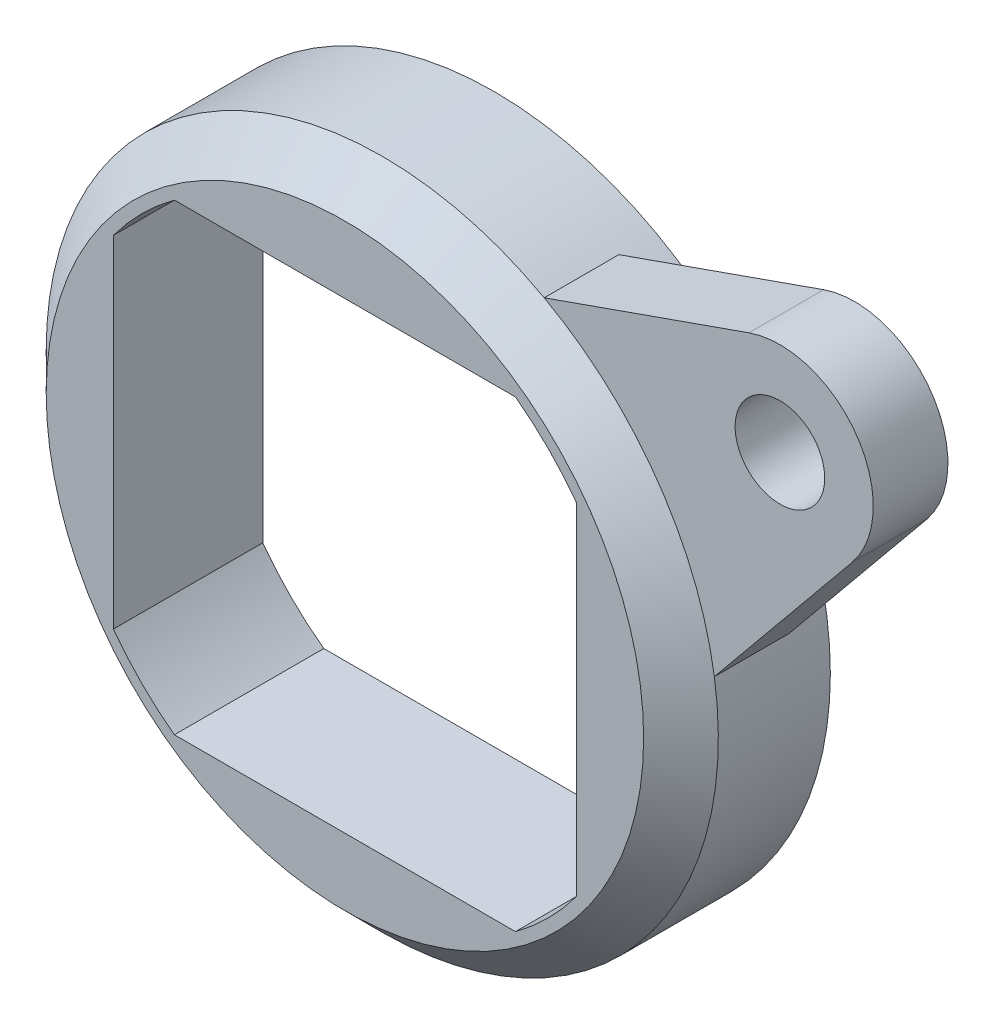
ISO-10303-21;
HEADER;
FILE_DESCRIPTION(('STEP AP214'),'2;1');
FILE_NAME('part.step','',(''),(''),'','','');
FILE_SCHEMA(('AUTOMOTIVE_DESIGN { 1 0 10303 214 1 1 1 1 }'));
ENDSEC;
DATA;
#1=APPLICATION_CONTEXT('core data for automotive mechanical design processes');
#2=APPLICATION_PROTOCOL_DEFINITION('international standard','automotive_design',2000,#1);
#3=PRODUCT_CONTEXT('',#1,'mechanical');
#4=PRODUCT('Part','Part','',(#3));
#5=PRODUCT_RELATED_PRODUCT_CATEGORY('part','',(#4));
#6=PRODUCT_DEFINITION_FORMATION('','',#4);
#7=PRODUCT_DEFINITION_CONTEXT('part definition',#1,'design');
#8=PRODUCT_DEFINITION('design','',#6,#7);
#9=PRODUCT_DEFINITION_SHAPE('','',#8);
#10=(LENGTH_UNIT() NAMED_UNIT(*) SI_UNIT(.MILLI.,.METRE.));
#11=(NAMED_UNIT(*) PLANE_ANGLE_UNIT() SI_UNIT($,.RADIAN.));
#12=(NAMED_UNIT(*) SI_UNIT($,.STERADIAN.) SOLID_ANGLE_UNIT());
#13=UNCERTAINTY_MEASURE_WITH_UNIT(LENGTH_MEASURE(1.E-05),#10,'distance_accuracy_value','');
#14=(GEOMETRIC_REPRESENTATION_CONTEXT(3) GLOBAL_UNCERTAINTY_ASSIGNED_CONTEXT((#13)) GLOBAL_UNIT_ASSIGNED_CONTEXT((#10,
#11,#12)) REPRESENTATION_CONTEXT('',''));
#15=CARTESIAN_POINT('',(0.,0.,0.));
#16=DIRECTION('',(0.,0.,1.));
#17=DIRECTION('',(1.,0.,0.));
#18=AXIS2_PLACEMENT_3D('',#15,#16,#17);
#19=CARTESIAN_POINT('',(0.,0.,24.9));
#20=DIRECTION('',(0.,0.,-1.));
#21=DIRECTION('',(-1.,0.,0.));
#22=AXIS2_PLACEMENT_3D('',#19,#20,#21);
#23=CYLINDRICAL_SURFACE('',#22,9.);
#24=DIRECTION('',(0.,0.,-1.));
#25=VECTOR('',#24,1.);
#26=CARTESIAN_POINT('',(8.8938586878365,1.37814282307574,23.9));
#27=LINE('',#26,#25);
#28=CARTESIAN_POINT('',(8.8938586878365,1.37814282307574,23.9));
#29=VERTEX_POINT('',#28);
#30=CARTESIAN_POINT('',(8.8938586878365,1.37814282307574,21.9));
#31=VERTEX_POINT('',#30);
#32=EDGE_CURVE('E157',#29,#31,#27,.T.);
#33=ORIENTED_EDGE('',*,*,#32,.F.);
#34=CARTESIAN_POINT('',(0.,0.,23.9));
#35=DIRECTION('',(0.,0.,1.));
#36=DIRECTION('',(1.,0.,0.));
#37=AXIS2_PLACEMENT_3D('',#34,#35,#36);
#38=CIRCLE('',#37,9.);
#39=CARTESIAN_POINT('',(4.33690946436556,7.88614077340092,23.9));
#40=VERTEX_POINT('',#39);
#41=EDGE_CURVE('E12',#29,#40,#38,.F.);
#42=ORIENTED_EDGE('',*,*,#41,.T.);
#43=DIRECTION('',(0.,0.,-1.));
#44=VECTOR('',#43,1.);
#45=CARTESIAN_POINT('',(4.33690946436556,7.88614077340092,23.9));
#46=LINE('',#45,#44);
#47=CARTESIAN_POINT('',(4.33690946436556,7.88614077340092,21.9));
#48=VERTEX_POINT('',#47);
#49=EDGE_CURVE('E136',#40,#48,#46,.T.);
#50=ORIENTED_EDGE('',*,*,#49,.T.);
#51=CARTESIAN_POINT('',(0.,0.,21.9));
#52=DIRECTION('',(0.,0.,1.));
#53=DIRECTION('',(1.,0.,0.));
#54=AXIS2_PLACEMENT_3D('',#51,#52,#53);
#55=CIRCLE('',#54,9.);
#56=EDGE_CURVE('E296',#31,#48,#55,.T.);
#57=ORIENTED_EDGE('',*,*,#56,.F.);
#58=EDGE_LOOP('',(#33,#42,#50,#57));
#59=FACE_BOUND('',#58,.T.);
#60=CARTESIAN_POINT('',(0.,0.,20.9));
#61=DIRECTION('',(0.,0.,1.));
#62=DIRECTION('',(1.,0.,0.));
#63=AXIS2_PLACEMENT_3D('',#60,#61,#62);
#64=CIRCLE('',#63,9.);
#65=CARTESIAN_POINT('',(9.,0.,20.9));
#66=VERTEX_POINT('',#65);
#67=EDGE_CURVE('E203',#66,#66,#64,.T.);
#68=ORIENTED_EDGE('',*,*,#67,.T.);
#69=EDGE_LOOP('',(#68));
#70=FACE_BOUND('',#69,.T.);
#71=ADVANCED_FACE('F43',(#59,#70),#23,.T.);
#72=CARTESIAN_POINT('',(0.,0.,24.9));
#73=DIRECTION('',(0.,0.,1.));
#74=DIRECTION('',(1.,0.,0.));
#75=AXIS2_PLACEMENT_3D('',#72,#73,#74);
#76=PLANE('',#75);
#77=CARTESIAN_POINT('',(0.,0.,24.9));
#78=DIRECTION('',(0.,0.,1.));
#79=DIRECTION('',(1.,0.,0.));
#80=AXIS2_PLACEMENT_3D('',#77,#78,#79);
#81=CIRCLE('',#80,8.);
#82=CARTESIAN_POINT('',(8.,0.,24.9));
#83=VERTEX_POINT('',#82);
#84=EDGE_CURVE('E52',#83,#83,#81,.T.);
#85=ORIENTED_EDGE('',*,*,#84,.T.);
#86=EDGE_LOOP('',(#85));
#87=FACE_BOUND('',#86,.T.);
#88=DIRECTION('',(0.,1.,0.));
#89=VECTOR('',#88,1.);
#90=CARTESIAN_POINT('',(-6.2,-15.,24.9));
#91=LINE('',#90,#89);
#92=CARTESIAN_POINT('',(-6.2,-4.56618002273235,24.9));
#93=VERTEX_POINT('',#92);
#94=CARTESIAN_POINT('',(-6.2,4.56618002273235,24.9));
#95=VERTEX_POINT('',#94);
#96=EDGE_CURVE('E161',#93,#95,#91,.T.);
#97=ORIENTED_EDGE('',*,*,#96,.T.);
#98=CARTESIAN_POINT('',(0.,0.,24.9));
#99=DIRECTION('',(0.,0.,1.));
#100=DIRECTION('',(1.,0.,0.));
#101=AXIS2_PLACEMENT_3D('',#98,#99,#100);
#102=CIRCLE('',#101,7.7);
#103=CARTESIAN_POINT('',(-4.56618002273235,6.2,24.9));
#104=VERTEX_POINT('',#103);
#105=EDGE_CURVE('E164',#104,#95,#102,.T.);
#106=ORIENTED_EDGE('',*,*,#105,.F.);
#107=DIRECTION('',(-1.,0.,0.));
#108=VECTOR('',#107,1.);
#109=CARTESIAN_POINT('',(-11.07277942026,6.2,24.9));
#110=LINE('',#109,#108);
#111=CARTESIAN_POINT('',(4.56618002273235,6.2,24.9));
#112=VERTEX_POINT('',#111);
#113=EDGE_CURVE('E167',#112,#104,#110,.T.);
#114=ORIENTED_EDGE('',*,*,#113,.F.);
#115=CARTESIAN_POINT('',(0.,0.,24.9));
#116=DIRECTION('',(0.,0.,1.));
#117=DIRECTION('',(1.,0.,0.));
#118=AXIS2_PLACEMENT_3D('',#115,#116,#117);
#119=CIRCLE('',#118,7.7);
#120=CARTESIAN_POINT('',(6.2,4.56618002273235,24.9));
#121=VERTEX_POINT('',#120);
#122=EDGE_CURVE('E170',#121,#112,#119,.T.);
#123=ORIENTED_EDGE('',*,*,#122,.F.);
#124=DIRECTION('',(0.,1.,0.));
#125=VECTOR('',#124,1.);
#126=CARTESIAN_POINT('',(6.2,-15.,24.9));
#127=LINE('',#126,#125);
#128=CARTESIAN_POINT('',(6.2,-4.56618002273235,24.9));
#129=VERTEX_POINT('',#128);
#130=EDGE_CURVE('E172',#129,#121,#127,.T.);
#131=ORIENTED_EDGE('',*,*,#130,.F.);
#132=CARTESIAN_POINT('',(0.,0.,24.9));
#133=DIRECTION('',(0.,0.,1.));
#134=DIRECTION('',(1.,0.,0.));
#135=AXIS2_PLACEMENT_3D('',#132,#133,#134);
#136=CIRCLE('',#135,7.7);
#137=CARTESIAN_POINT('',(4.56618002273235,-6.2,24.9));
#138=VERTEX_POINT('',#137);
#139=EDGE_CURVE('E174',#138,#129,#136,.T.);
#140=ORIENTED_EDGE('',*,*,#139,.F.);
#141=DIRECTION('',(-1.,0.,0.));
#142=VECTOR('',#141,1.);
#143=CARTESIAN_POINT('',(-11.07277942026,-6.2,24.9));
#144=LINE('',#143,#142);
#145=CARTESIAN_POINT('',(-4.56618002273236,-6.2,24.9));
#146=VERTEX_POINT('',#145);
#147=EDGE_CURVE('E176',#138,#146,#144,.T.);
#148=ORIENTED_EDGE('',*,*,#147,.T.);
#149=CARTESIAN_POINT('',(0.,0.,24.9));
#150=DIRECTION('',(0.,0.,1.));
#151=DIRECTION('',(1.,0.,0.));
#152=AXIS2_PLACEMENT_3D('',#149,#150,#151);
#153=CIRCLE('',#152,7.7);
#154=EDGE_CURVE('E179',#93,#146,#153,.T.);
#155=ORIENTED_EDGE('',*,*,#154,.F.);
#156=EDGE_LOOP('',(#97,#106,#114,#123,#131,#140,#148,#155));
#157=FACE_BOUND('',#156,.T.);
#158=ADVANCED_FACE('F222',(#87,#157),#76,.T.);
#159=CARTESIAN_POINT('',(0.,0.,20.9));
#160=DIRECTION('',(0.,0.,1.));
#161=DIRECTION('',(1.,0.,0.));
#162=AXIS2_PLACEMENT_3D('',#159,#160,#161);
#163=PLANE('',#162);
#164=CARTESIAN_POINT('',(0.,0.,20.9));
#165=DIRECTION('',(0.,0.,1.));
#166=DIRECTION('',(1.,0.,0.));
#167=AXIS2_PLACEMENT_3D('',#164,#165,#166);
#168=CIRCLE('',#167,7.7);
#169=CARTESIAN_POINT('',(-4.56618002273235,6.2,20.9));
#170=VERTEX_POINT('',#169);
#171=CARTESIAN_POINT('',(-6.2,4.56618002273235,20.9));
#172=VERTEX_POINT('',#171);
#173=EDGE_CURVE('E155',#170,#172,#168,.T.);
#174=ORIENTED_EDGE('',*,*,#173,.T.);
#175=DIRECTION('',(0.,1.,0.));
#176=VECTOR('',#175,1.);
#177=CARTESIAN_POINT('',(-6.2,-15.,20.9));
#178=LINE('',#177,#176);
#179=CARTESIAN_POINT('',(-6.2,-4.56618002273235,20.9));
#180=VERTEX_POINT('',#179);
#181=EDGE_CURVE('E153',#180,#172,#178,.T.);
#182=ORIENTED_EDGE('',*,*,#181,.F.);
#183=CARTESIAN_POINT('',(0.,0.,20.9));
#184=DIRECTION('',(0.,0.,1.));
#185=DIRECTION('',(1.,0.,0.));
#186=AXIS2_PLACEMENT_3D('',#183,#184,#185);
#187=CIRCLE('',#186,7.7);
#188=CARTESIAN_POINT('',(-4.56618002273236,-6.2,20.9));
#189=VERTEX_POINT('',#188);
#190=EDGE_CURVE('E165',#180,#189,#187,.T.);
#191=ORIENTED_EDGE('',*,*,#190,.T.);
#192=DIRECTION('',(-1.,0.,0.));
#193=VECTOR('',#192,1.);
#194=CARTESIAN_POINT('',(-11.07277942026,-6.2,20.9));
#195=LINE('',#194,#193);
#196=CARTESIAN_POINT('',(4.56618002273235,-6.2,20.9));
#197=VERTEX_POINT('',#196);
#198=EDGE_CURVE('E196',#197,#189,#195,.T.);
#199=ORIENTED_EDGE('',*,*,#198,.F.);
#200=CARTESIAN_POINT('',(0.,0.,20.9));
#201=DIRECTION('',(0.,0.,1.));
#202=DIRECTION('',(1.,0.,0.));
#203=AXIS2_PLACEMENT_3D('',#200,#201,#202);
#204=CIRCLE('',#203,7.7);
#205=CARTESIAN_POINT('',(6.2,-4.56618002273235,20.9));
#206=VERTEX_POINT('',#205);
#207=EDGE_CURVE('E193',#197,#206,#204,.T.);
#208=ORIENTED_EDGE('',*,*,#207,.T.);
#209=DIRECTION('',(0.,1.,0.));
#210=VECTOR('',#209,1.);
#211=CARTESIAN_POINT('',(6.2,-15.,20.9));
#212=LINE('',#211,#210);
#213=CARTESIAN_POINT('',(6.2,4.56618002273235,20.9));
#214=VERTEX_POINT('',#213);
#215=EDGE_CURVE('E190',#206,#214,#212,.T.);
#216=ORIENTED_EDGE('',*,*,#215,.T.);
#217=CARTESIAN_POINT('',(0.,0.,20.9));
#218=DIRECTION('',(0.,0.,1.));
#219=DIRECTION('',(1.,0.,0.));
#220=AXIS2_PLACEMENT_3D('',#217,#218,#219);
#221=CIRCLE('',#220,7.7);
#222=CARTESIAN_POINT('',(4.56618002273235,6.2,20.9));
#223=VERTEX_POINT('',#222);
#224=EDGE_CURVE('E187',#214,#223,#221,.T.);
#225=ORIENTED_EDGE('',*,*,#224,.T.);
#226=DIRECTION('',(-1.,0.,0.));
#227=VECTOR('',#226,1.);
#228=CARTESIAN_POINT('',(-11.07277942026,6.2,20.9));
#229=LINE('',#228,#227);
#230=EDGE_CURVE('E184',#223,#170,#229,.T.);
#231=ORIENTED_EDGE('',*,*,#230,.T.);
#232=EDGE_LOOP('',(#174,#182,#191,#199,#208,#216,#225,#231));
#233=FACE_BOUND('',#232,.T.);
#234=ORIENTED_EDGE('',*,*,#67,.F.);
#235=EDGE_LOOP('',(#234));
#236=FACE_BOUND('',#235,.T.);
#237=ADVANCED_FACE('F236',(#233,#236),#163,.F.);
#238=CARTESIAN_POINT('',(-6.2,-15.,24.9));
#239=DIRECTION('',(-1.,0.,0.));
#240=DIRECTION('',(0.,0.,1.));
#241=AXIS2_PLACEMENT_3D('',#238,#239,#240);
#242=PLANE('',#241);
#243=ORIENTED_EDGE('',*,*,#181,.T.);
#244=DIRECTION('',(0.,0.,-1.));
#245=VECTOR('',#244,1.);
#246=CARTESIAN_POINT('',(-6.2,4.56618002273235,24.9));
#247=LINE('',#246,#245);
#248=EDGE_CURVE('E180',#95,#172,#247,.T.);
#249=ORIENTED_EDGE('',*,*,#248,.F.);
#250=ORIENTED_EDGE('',*,*,#96,.F.);
#251=DIRECTION('',(0.,0.,-1.));
#252=VECTOR('',#251,1.);
#253=CARTESIAN_POINT('',(-6.2,-4.56618002273235,24.9));
#254=LINE('',#253,#252);
#255=EDGE_CURVE('E201',#93,#180,#254,.T.);
#256=ORIENTED_EDGE('',*,*,#255,.T.);
#257=EDGE_LOOP('',(#243,#249,#250,#256));
#258=FACE_BOUND('',#257,.T.);
#259=ADVANCED_FACE('F241',(#258),#242,.F.);
#260=CARTESIAN_POINT('',(0.,0.,24.9));
#261=DIRECTION('',(0.,0.,-1.));
#262=DIRECTION('',(-1.,0.,0.));
#263=AXIS2_PLACEMENT_3D('',#260,#261,#262);
#264=CYLINDRICAL_SURFACE('',#263,7.7);
#265=ORIENTED_EDGE('',*,*,#190,.F.);
#266=ORIENTED_EDGE('',*,*,#255,.F.);
#267=ORIENTED_EDGE('',*,*,#154,.T.);
#268=DIRECTION('',(0.,0.,-1.));
#269=VECTOR('',#268,1.);
#270=CARTESIAN_POINT('',(-4.56618002273236,-6.2,24.9));
#271=LINE('',#270,#269);
#272=EDGE_CURVE('E204',#146,#189,#271,.T.);
#273=ORIENTED_EDGE('',*,*,#272,.T.);
#274=EDGE_LOOP('',(#265,#266,#267,#273));
#275=FACE_BOUND('',#274,.T.);
#276=ADVANCED_FACE('F246',(#275),#264,.F.);
#277=CARTESIAN_POINT('',(-11.07277942026,-6.2,24.9));
#278=DIRECTION('',(0.,-1.,0.));
#279=DIRECTION('',(0.,0.,-1.));
#280=AXIS2_PLACEMENT_3D('',#277,#278,#279);
#281=PLANE('',#280);
#282=ORIENTED_EDGE('',*,*,#198,.T.);
#283=ORIENTED_EDGE('',*,*,#272,.F.);
#284=ORIENTED_EDGE('',*,*,#147,.F.);
#285=DIRECTION('',(0.,0.,-1.));
#286=VECTOR('',#285,1.);
#287=CARTESIAN_POINT('',(4.56618002273235,-6.2,24.9));
#288=LINE('',#287,#286);
#289=EDGE_CURVE('E206',#138,#197,#288,.T.);
#290=ORIENTED_EDGE('',*,*,#289,.T.);
#291=EDGE_LOOP('',(#282,#283,#284,#290));
#292=FACE_BOUND('',#291,.T.);
#293=ADVANCED_FACE('F267',(#292),#281,.F.);
#294=CARTESIAN_POINT('',(0.,0.,24.9));
#295=DIRECTION('',(0.,0.,-1.));
#296=DIRECTION('',(-1.,0.,0.));
#297=AXIS2_PLACEMENT_3D('',#294,#295,#296);
#298=CYLINDRICAL_SURFACE('',#297,7.7);
#299=ORIENTED_EDGE('',*,*,#207,.F.);
#300=ORIENTED_EDGE('',*,*,#289,.F.);
#301=ORIENTED_EDGE('',*,*,#139,.T.);
#302=DIRECTION('',(0.,0.,-1.));
#303=VECTOR('',#302,1.);
#304=CARTESIAN_POINT('',(6.2,-4.56618002273235,24.9));
#305=LINE('',#304,#303);
#306=EDGE_CURVE('E208',#129,#206,#305,.T.);
#307=ORIENTED_EDGE('',*,*,#306,.T.);
#308=EDGE_LOOP('',(#299,#300,#301,#307));
#309=FACE_BOUND('',#308,.T.);
#310=ADVANCED_FACE('F263',(#309),#298,.F.);
#311=CARTESIAN_POINT('',(6.2,-15.,24.9));
#312=DIRECTION('',(-1.,0.,0.));
#313=DIRECTION('',(0.,0.,1.));
#314=AXIS2_PLACEMENT_3D('',#311,#312,#313);
#315=PLANE('',#314);
#316=ORIENTED_EDGE('',*,*,#215,.F.);
#317=ORIENTED_EDGE('',*,*,#306,.F.);
#318=ORIENTED_EDGE('',*,*,#130,.T.);
#319=DIRECTION('',(0.,0.,-1.));
#320=VECTOR('',#319,1.);
#321=CARTESIAN_POINT('',(6.2,4.56618002273235,24.9));
#322=LINE('',#321,#320);
#323=EDGE_CURVE('E210',#121,#214,#322,.T.);
#324=ORIENTED_EDGE('',*,*,#323,.T.);
#325=EDGE_LOOP('',(#316,#317,#318,#324));
#326=FACE_BOUND('',#325,.T.);
#327=ADVANCED_FACE('F259',(#326),#315,.T.);
#328=CARTESIAN_POINT('',(0.,0.,24.9));
#329=DIRECTION('',(0.,0.,-1.));
#330=DIRECTION('',(-1.,0.,0.));
#331=AXIS2_PLACEMENT_3D('',#328,#329,#330);
#332=CYLINDRICAL_SURFACE('',#331,7.7);
#333=ORIENTED_EDGE('',*,*,#224,.F.);
#334=ORIENTED_EDGE('',*,*,#323,.F.);
#335=ORIENTED_EDGE('',*,*,#122,.T.);
#336=DIRECTION('',(0.,0.,-1.));
#337=VECTOR('',#336,1.);
#338=CARTESIAN_POINT('',(4.56618002273235,6.2,24.9));
#339=LINE('',#338,#337);
#340=EDGE_CURVE('E212',#112,#223,#339,.T.);
#341=ORIENTED_EDGE('',*,*,#340,.T.);
#342=EDGE_LOOP('',(#333,#334,#335,#341));
#343=FACE_BOUND('',#342,.T.);
#344=ADVANCED_FACE('F255',(#343),#332,.F.);
#345=CARTESIAN_POINT('',(-11.07277942026,6.2,24.9));
#346=DIRECTION('',(0.,-1.,0.));
#347=DIRECTION('',(0.,0.,-1.));
#348=AXIS2_PLACEMENT_3D('',#345,#346,#347);
#349=PLANE('',#348);
#350=ORIENTED_EDGE('',*,*,#230,.F.);
#351=ORIENTED_EDGE('',*,*,#340,.F.);
#352=ORIENTED_EDGE('',*,*,#113,.T.);
#353=DIRECTION('',(0.,0.,-1.));
#354=VECTOR('',#353,1.);
#355=CARTESIAN_POINT('',(-4.56618002273235,6.2,24.9));
#356=LINE('',#355,#354);
#357=EDGE_CURVE('E214',#104,#170,#356,.T.);
#358=ORIENTED_EDGE('',*,*,#357,.T.);
#359=EDGE_LOOP('',(#350,#351,#352,#358));
#360=FACE_BOUND('',#359,.T.);
#361=ADVANCED_FACE('F251',(#360),#349,.T.);
#362=CARTESIAN_POINT('',(0.,0.,24.9));
#363=DIRECTION('',(0.,0.,-1.));
#364=DIRECTION('',(-1.,0.,0.));
#365=AXIS2_PLACEMENT_3D('',#362,#363,#364);
#366=CYLINDRICAL_SURFACE('',#365,7.7);
#367=ORIENTED_EDGE('',*,*,#173,.F.);
#368=ORIENTED_EDGE('',*,*,#357,.F.);
#369=ORIENTED_EDGE('',*,*,#105,.T.);
#370=ORIENTED_EDGE('',*,*,#248,.T.);
#371=EDGE_LOOP('',(#367,#368,#369,#370));
#372=FACE_BOUND('',#371,.T.);
#373=ADVANCED_FACE('F248',(#372),#366,.F.);
#374=CARTESIAN_POINT('',(10.648976575757,7.4564936725635,23.9));
#375=DIRECTION('',(0.,0.,-1.));
#376=DIRECTION('',(-1.,0.,0.));
#377=AXIS2_PLACEMENT_3D('',#374,#375,#376);
#378=CYLINDRICAL_SURFACE('',#377,2.5);
#379=CARTESIAN_POINT('',(10.648976575757,7.4564936725635,21.9));
#380=DIRECTION('',(0.,0.,1.));
#381=DIRECTION('',(1.,0.,0.));
#382=AXIS2_PLACEMENT_3D('',#379,#380,#381);
#383=CIRCLE('',#382,2.5);
#384=CARTESIAN_POINT('',(12.5813227249027,5.87029117607016,21.9));
#385=VERTEX_POINT('',#384);
#386=CARTESIAN_POINT('',(9.81933510161566,9.814818294914,21.9));
#387=VERTEX_POINT('',#386);
#388=EDGE_CURVE('E152',#385,#387,#383,.T.);
#389=ORIENTED_EDGE('',*,*,#388,.T.);
#390=DIRECTION('',(0.,0.,-1.));
#391=VECTOR('',#390,1.);
#392=CARTESIAN_POINT('',(9.81933510161566,9.814818294914,23.9));
#393=LINE('',#392,#391);
#394=CARTESIAN_POINT('',(9.81933510161566,9.814818294914,23.9));
#395=VERTEX_POINT('',#394);
#396=EDGE_CURVE('E134',#395,#387,#393,.T.);
#397=ORIENTED_EDGE('',*,*,#396,.F.);
#398=CARTESIAN_POINT('',(10.648976575757,7.4564936725635,23.9));
#399=DIRECTION('',(0.,0.,1.));
#400=DIRECTION('',(1.,0.,0.));
#401=AXIS2_PLACEMENT_3D('',#398,#399,#400);
#402=CIRCLE('',#401,2.5);
#403=CARTESIAN_POINT('',(12.5813227249027,5.87029117607016,23.9));
#404=VERTEX_POINT('',#403);
#405=EDGE_CURVE('E140',#404,#395,#402,.T.);
#406=ORIENTED_EDGE('',*,*,#405,.F.);
#407=DIRECTION('',(0.,0.,-1.));
#408=VECTOR('',#407,1.);
#409=CARTESIAN_POINT('',(12.5813227249027,5.87029117607016,23.9));
#410=LINE('',#409,#408);
#411=EDGE_CURVE('E301',#404,#385,#410,.T.);
#412=ORIENTED_EDGE('',*,*,#411,.T.);
#413=EDGE_LOOP('',(#389,#397,#406,#412));
#414=FACE_BOUND('',#413,.T.);
#415=ADVANCED_FACE('F150',(#414),#378,.T.);
#416=CARTESIAN_POINT('',(-1.99113953793913,5.65997909364121,23.9));
#417=DIRECTION('',(0.331856589656522,-0.943329848940201,0.));
#418=DIRECTION('',(0.943329848940201,0.331856589656522,0.));
#419=AXIS2_PLACEMENT_3D('',#416,#417,#418);
#420=PLANE('',#419);
#421=DIRECTION('',(-0.943329848940201,-0.331856589656522,0.));
#422=VECTOR('',#421,1.);
#423=CARTESIAN_POINT('',(-1.99113953793913,5.65997909364121,21.9));
#424=LINE('',#423,#422);
#425=EDGE_CURVE('E306',#387,#48,#424,.T.);
#426=ORIENTED_EDGE('',*,*,#425,.T.);
#427=ORIENTED_EDGE('',*,*,#49,.F.);
#428=DIRECTION('',(-0.943329848940201,-0.331856589656522,0.));
#429=VECTOR('',#428,1.);
#430=CARTESIAN_POINT('',(-1.99113953793913,5.65997909364121,23.9));
#431=LINE('',#430,#429);
#432=EDGE_CURVE('E129',#395,#40,#431,.T.);
#433=ORIENTED_EDGE('',*,*,#432,.F.);
#434=ORIENTED_EDGE('',*,*,#396,.T.);
#435=EDGE_LOOP('',(#426,#427,#433,#434));
#436=FACE_BOUND('',#435,.T.);
#437=ADVANCED_FACE('F132',(#436),#420,.F.);
#438=CARTESIAN_POINT('',(10.648976575757,7.4564936725635,23.9));
#439=DIRECTION('',(0.,0.,-1.));
#440=DIRECTION('',(-1.,0.,0.));
#441=AXIS2_PLACEMENT_3D('',#438,#439,#440);
#442=CYLINDRICAL_SURFACE('',#441,1.2);
#443=CARTESIAN_POINT('',(10.648976575757,7.4564936725635,23.9));
#444=DIRECTION('',(0.,0.,1.));
#445=DIRECTION('',(1.,0.,0.));
#446=AXIS2_PLACEMENT_3D('',#443,#444,#445);
#447=CIRCLE('',#446,1.2);
#448=CARTESIAN_POINT('',(11.848976575757,7.4564936725635,23.9));
#449=VERTEX_POINT('',#448);
#450=EDGE_CURVE('E148',#449,#449,#447,.T.);
#451=ORIENTED_EDGE('',*,*,#450,.T.);
#452=EDGE_LOOP('',(#451));
#453=FACE_BOUND('',#452,.T.);
#454=CARTESIAN_POINT('',(10.648976575757,7.4564936725635,21.9));
#455=DIRECTION('',(0.,0.,1.));
#456=DIRECTION('',(1.,0.,0.));
#457=AXIS2_PLACEMENT_3D('',#454,#455,#456);
#458=CIRCLE('',#457,1.2);
#459=CARTESIAN_POINT('',(11.848976575757,7.4564936725635,21.9));
#460=VERTEX_POINT('',#459);
#461=EDGE_CURVE('E302',#460,#460,#458,.T.);
#462=ORIENTED_EDGE('',*,*,#461,.F.);
#463=EDGE_LOOP('',(#462));
#464=FACE_BOUND('',#463,.T.);
#465=ADVANCED_FACE('F275',(#453,#464),#442,.F.);
#466=CARTESIAN_POINT('',(4.63763075794974,-3.80688599158401,23.9));
#467=DIRECTION('',(0.772938459658289,-0.634480998597335,0.));
#468=DIRECTION('',(0.634480998597335,0.772938459658289,0.));
#469=AXIS2_PLACEMENT_3D('',#466,#467,#468);
#470=PLANE('',#469);
#471=DIRECTION('',(-0.634480998597335,-0.772938459658289,0.));
#472=VECTOR('',#471,1.);
#473=CARTESIAN_POINT('',(4.63763075794974,-3.80688599158401,21.9));
#474=LINE('',#473,#472);
#475=EDGE_CURVE('E293',#385,#31,#474,.T.);
#476=ORIENTED_EDGE('',*,*,#475,.F.);
#477=ORIENTED_EDGE('',*,*,#411,.F.);
#478=DIRECTION('',(-0.634480998597335,-0.772938459658289,0.));
#479=VECTOR('',#478,1.);
#480=CARTESIAN_POINT('',(4.63763075794974,-3.80688599158401,23.9));
#481=LINE('',#480,#479);
#482=EDGE_CURVE('E146',#404,#29,#481,.T.);
#483=ORIENTED_EDGE('',*,*,#482,.T.);
#484=ORIENTED_EDGE('',*,*,#32,.T.);
#485=EDGE_LOOP('',(#476,#477,#483,#484));
#486=FACE_BOUND('',#485,.T.);
#487=ADVANCED_FACE('F278',(#486),#470,.T.);
#488=CARTESIAN_POINT('',(0.,0.,23.9));
#489=DIRECTION('',(0.,0.,1.));
#490=DIRECTION('',(1.,0.,0.));
#491=AXIS2_PLACEMENT_3D('',#488,#489,#490);
#492=PLANE('',#491);
#493=ORIENTED_EDGE('',*,*,#450,.F.);
#494=EDGE_LOOP('',(#493));
#495=FACE_BOUND('',#494,.T.);
#496=ORIENTED_EDGE('',*,*,#405,.T.);
#497=ORIENTED_EDGE('',*,*,#432,.T.);
#498=CARTESIAN_POINT('',(0.,0.,23.9));
#499=DIRECTION('',(0.,0.,1.));
#500=DIRECTION('',(1.,0.,0.));
#501=AXIS2_PLACEMENT_3D('',#498,#499,#500);
#502=CIRCLE('',#501,9.);
#503=EDGE_CURVE('E139',#29,#40,#502,.T.);
#504=ORIENTED_EDGE('',*,*,#503,.F.);
#505=ORIENTED_EDGE('',*,*,#482,.F.);
#506=EDGE_LOOP('',(#496,#497,#504,#505));
#507=FACE_BOUND('',#506,.T.);
#508=ADVANCED_FACE('F144',(#495,#507),#492,.T.);
#509=CARTESIAN_POINT('',(0.,0.,21.9));
#510=DIRECTION('',(0.,0.,1.));
#511=DIRECTION('',(1.,0.,0.));
#512=AXIS2_PLACEMENT_3D('',#509,#510,#511);
#513=PLANE('',#512);
#514=ORIENTED_EDGE('',*,*,#461,.T.);
#515=EDGE_LOOP('',(#514));
#516=FACE_BOUND('',#515,.T.);
#517=ORIENTED_EDGE('',*,*,#388,.F.);
#518=ORIENTED_EDGE('',*,*,#475,.T.);
#519=ORIENTED_EDGE('',*,*,#56,.T.);
#520=ORIENTED_EDGE('',*,*,#425,.F.);
#521=EDGE_LOOP('',(#517,#518,#519,#520));
#522=FACE_BOUND('',#521,.T.);
#523=ADVANCED_FACE('F226',(#516,#522),#513,.F.);
#524=CARTESIAN_POINT('',(0.,0.,24.9));
#525=DIRECTION('',(0.,0.,-1.));
#526=DIRECTION('',(-1.,0.,0.));
#527=AXIS2_PLACEMENT_3D('',#524,#525,#526);
#528=CONICAL_SURFACE('',#527,8.,0.785398163397447);
#529=ORIENTED_EDGE('',*,*,#41,.F.);
#530=ORIENTED_EDGE('',*,*,#503,.T.);
#531=EDGE_LOOP('',(#529,#530));
#532=FACE_BOUND('',#531,.T.);
#533=ORIENTED_EDGE('',*,*,#84,.F.);
#534=EDGE_LOOP('',(#533));
#535=FACE_BOUND('',#534,.T.);
#536=ADVANCED_FACE('F46',(#532,#535),#528,.T.);
#537=CLOSED_SHELL('',(#71,#158,#237,#259,#276,#293,#310,#327,#344,#361,#373,#415,#437,#465,#487,
#508,#523,#536));
#538=MANIFOLD_SOLID_BREP('B2',#537);
#539=ADVANCED_BREP_SHAPE_REPRESENTATION('',(#18,#538),#14);
#540=SHAPE_DEFINITION_REPRESENTATION(#9,#539);
ENDSEC;
END-ISO-10303-21;
